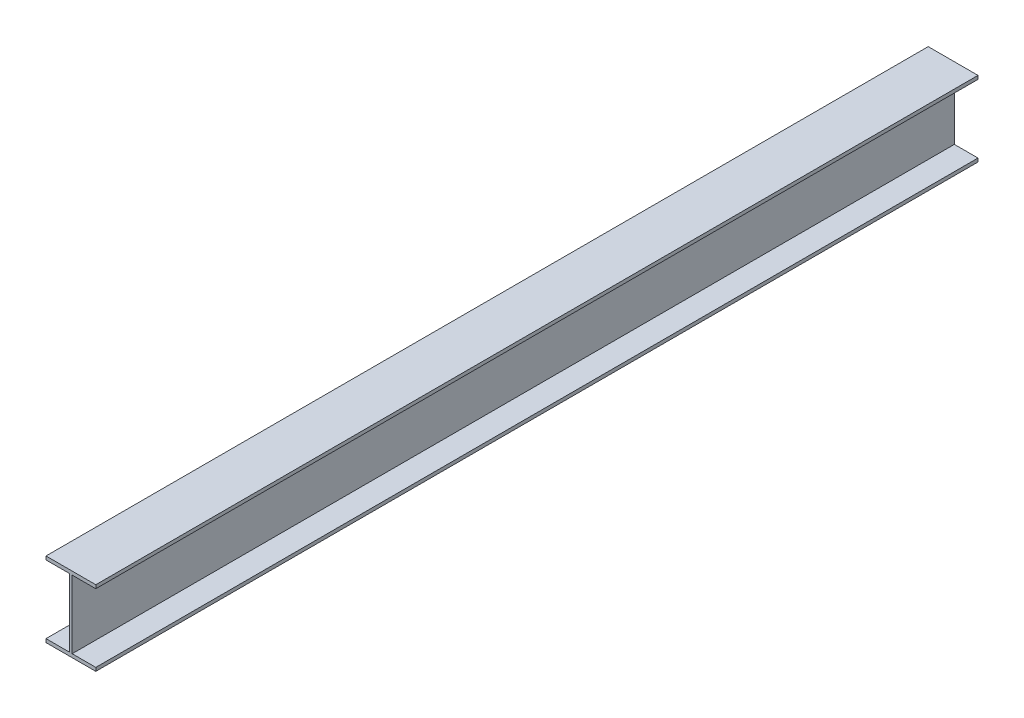
ISO-10303-21;
HEADER;
FILE_DESCRIPTION(('STEP AP214'),'2;1');
FILE_NAME('part.step','',(''),(''),'','','');
FILE_SCHEMA(('AUTOMOTIVE_DESIGN { 1 0 10303 214 1 1 1 1 }'));
ENDSEC;
DATA;
#1=APPLICATION_CONTEXT('core data for automotive mechanical design processes');
#2=APPLICATION_PROTOCOL_DEFINITION('international standard','automotive_design',2000,#1);
#3=PRODUCT_CONTEXT('',#1,'mechanical');
#4=PRODUCT('Part','Part','',(#3));
#5=PRODUCT_RELATED_PRODUCT_CATEGORY('part','',(#4));
#6=PRODUCT_DEFINITION_FORMATION('','',#4);
#7=PRODUCT_DEFINITION_CONTEXT('part definition',#1,'design');
#8=PRODUCT_DEFINITION('design','',#6,#7);
#9=PRODUCT_DEFINITION_SHAPE('','',#8);
#10=(LENGTH_UNIT() NAMED_UNIT(*) SI_UNIT(.MILLI.,.METRE.));
#11=(NAMED_UNIT(*) PLANE_ANGLE_UNIT() SI_UNIT($,.RADIAN.));
#12=(NAMED_UNIT(*) SI_UNIT($,.STERADIAN.) SOLID_ANGLE_UNIT());
#13=UNCERTAINTY_MEASURE_WITH_UNIT(LENGTH_MEASURE(1.E-05),#10,'distance_accuracy_value','');
#14=(GEOMETRIC_REPRESENTATION_CONTEXT(3) GLOBAL_UNCERTAINTY_ASSIGNED_CONTEXT((#13)) GLOBAL_UNIT_ASSIGNED_CONTEXT((#10,
#11,#12)) REPRESENTATION_CONTEXT('',''));
#15=CARTESIAN_POINT('',(0.,0.,0.));
#16=DIRECTION('',(0.,0.,1.));
#17=DIRECTION('',(1.,0.,0.));
#18=AXIS2_PLACEMENT_3D('',#15,#16,#17);
#19=CARTESIAN_POINT('',(101.6,-153.162240532958,1800.));
#20=DIRECTION('',(0.,1.,0.));
#21=DIRECTION('',(0.,0.,1.));
#22=AXIS2_PLACEMENT_3D('',#19,#20,#21);
#23=PLANE('',#22);
#24=DIRECTION('',(1.,0.,0.));
#25=VECTOR('',#24,1.);
#26=CARTESIAN_POINT('',(101.6,-153.162240532958,750.));
#27=LINE('',#26,#25);
#28=CARTESIAN_POINT('',(0.,-153.162240532958,750.));
#29=VERTEX_POINT('',#28);
#30=CARTESIAN_POINT('',(101.6,-153.162240532958,750.));
#31=VERTEX_POINT('',#30);
#32=EDGE_CURVE('E11',#29,#31,#27,.T.);
#33=ORIENTED_EDGE('',*,*,#32,.F.);
#34=DIRECTION('',(0.,0.,-1.));
#35=VECTOR('',#34,1.);
#36=CARTESIAN_POINT('',(0.,-153.162240532958,1800.));
#37=LINE('',#36,#35);
#38=CARTESIAN_POINT('',(0.,-153.162240532958,0.));
#39=VERTEX_POINT('',#38);
#40=EDGE_CURVE('E176',#29,#39,#37,.T.);
#41=ORIENTED_EDGE('',*,*,#40,.T.);
#42=DIRECTION('',(1.,0.,0.));
#43=VECTOR('',#42,1.);
#44=CARTESIAN_POINT('',(101.6,-153.162240532958,0.));
#45=LINE('',#44,#43);
#46=CARTESIAN_POINT('',(101.6,-153.162240532958,0.));
#47=VERTEX_POINT('',#46);
#48=EDGE_CURVE('E210',#39,#47,#45,.T.);
#49=ORIENTED_EDGE('',*,*,#48,.T.);
#50=DIRECTION('',(0.,0.,-1.));
#51=VECTOR('',#50,1.);
#52=CARTESIAN_POINT('',(101.6,-153.162240532958,1800.));
#53=LINE('',#52,#51);
#54=EDGE_CURVE('E181',#31,#47,#53,.T.);
#55=ORIENTED_EDGE('',*,*,#54,.F.);
#56=EDGE_LOOP('',(#33,#41,#49,#55));
#57=FACE_BOUND('',#56,.T.);
#58=ADVANCED_FACE('F38',(#57),#23,.F.);
#59=DIRECTION('',(-1.,0.,0.));
#60=VECTOR('',#59,1.);
#61=CARTESIAN_POINT('',(101.600000000001,-153.162240532958,1050.));
#62=LINE('',#61,#60);
#63=CARTESIAN_POINT('',(101.6,-153.162240532958,1050.));
#64=VERTEX_POINT('',#63);
#65=CARTESIAN_POINT('',(0.,-153.162240532958,1050.));
#66=VERTEX_POINT('',#65);
#67=EDGE_CURVE('E47',#64,#66,#62,.T.);
#68=ORIENTED_EDGE('',*,*,#67,.F.);
#69=CARTESIAN_POINT('',(101.6,-153.162240532958,1800.));
#70=VERTEX_POINT('',#69);
#71=EDGE_CURVE('E177',#70,#64,#53,.T.);
#72=ORIENTED_EDGE('',*,*,#71,.F.);
#73=DIRECTION('',(1.,0.,0.));
#74=VECTOR('',#73,1.);
#75=CARTESIAN_POINT('',(101.6,-153.162240532958,1800.));
#76=LINE('',#75,#74);
#77=CARTESIAN_POINT('',(0.,-153.162240532958,1800.));
#78=VERTEX_POINT('',#77);
#79=EDGE_CURVE('E234',#78,#70,#76,.T.);
#80=ORIENTED_EDGE('',*,*,#79,.F.);
#81=EDGE_CURVE('E172',#78,#66,#37,.T.);
#82=ORIENTED_EDGE('',*,*,#81,.T.);
#83=EDGE_LOOP('',(#68,#72,#80,#82));
#84=FACE_BOUND('',#83,.T.);
#85=ADVANCED_FACE('F259',(#84),#23,.F.);
#86=CARTESIAN_POINT('',(0.,-7.11224053295814,1800.));
#87=DIRECTION('',(1.,0.,0.));
#88=DIRECTION('',(0.,0.,-1.));
#89=AXIS2_PLACEMENT_3D('',#86,#87,#88);
#90=PLANE('',#89);
#91=DIRECTION('',(0.,-1.,0.));
#92=VECTOR('',#91,1.);
#93=CARTESIAN_POINT('',(0.,-7.11224053295814,0.));
#94=LINE('',#93,#92);
#95=CARTESIAN_POINT('',(0.,-0.000240532958142959,0.));
#96=VERTEX_POINT('',#95);
#97=CARTESIAN_POINT('',(0.,-7.11224053295814,0.));
#98=VERTEX_POINT('',#97);
#99=EDGE_CURVE('E161',#96,#98,#94,.T.);
#100=ORIENTED_EDGE('',*,*,#99,.T.);
#101=DIRECTION('',(0.,0.,-1.));
#102=VECTOR('',#101,1.);
#103=CARTESIAN_POINT('',(0.,-7.11224053295814,1800.));
#104=LINE('',#103,#102);
#105=CARTESIAN_POINT('',(0.,-7.11224053295814,1800.));
#106=VERTEX_POINT('',#105);
#107=EDGE_CURVE('E142',#106,#98,#104,.T.);
#108=ORIENTED_EDGE('',*,*,#107,.F.);
#109=DIRECTION('',(0.,-1.,0.));
#110=VECTOR('',#109,1.);
#111=CARTESIAN_POINT('',(0.,-7.11224053295814,1800.));
#112=LINE('',#111,#110);
#113=CARTESIAN_POINT('',(0.,-0.000240532958142959,1800.));
#114=VERTEX_POINT('',#113);
#115=EDGE_CURVE('E149',#114,#106,#112,.T.);
#116=ORIENTED_EDGE('',*,*,#115,.F.);
#117=DIRECTION('',(0.,0.,-1.));
#118=VECTOR('',#117,1.);
#119=CARTESIAN_POINT('',(0.,-0.000240532958142959,1800.));
#120=LINE('',#119,#118);
#121=EDGE_CURVE('E197',#114,#96,#120,.T.);
#122=ORIENTED_EDGE('',*,*,#121,.T.);
#123=EDGE_LOOP('',(#100,#108,#116,#122));
#124=FACE_BOUND('',#123,.T.);
#125=ADVANCED_FACE('F40',(#124),#90,.F.);
#126=CARTESIAN_POINT('',(47.5660357142857,-7.11224053295814,1800.));
#127=DIRECTION('',(0.,1.,0.));
#128=DIRECTION('',(-1.,0.,0.));
#129=AXIS2_PLACEMENT_3D('',#126,#127,#128);
#130=PLANE('',#129);
#131=DIRECTION('',(1.,0.,0.));
#132=VECTOR('',#131,1.);
#133=CARTESIAN_POINT('',(47.5660357142857,-7.11224053295814,0.));
#134=LINE('',#133,#132);
#135=CARTESIAN_POINT('',(47.5660357142857,-7.11224053295814,0.));
#136=VERTEX_POINT('',#135);
#137=EDGE_CURVE('E220',#98,#136,#134,.T.);
#138=ORIENTED_EDGE('',*,*,#137,.T.);
#139=DIRECTION('',(0.,0.,-1.));
#140=VECTOR('',#139,1.);
#141=CARTESIAN_POINT('',(47.5660357142857,-7.11224053295814,1800.));
#142=LINE('',#141,#140);
#143=CARTESIAN_POINT('',(47.5660357142857,-7.11224053295814,1800.));
#144=VERTEX_POINT('',#143);
#145=EDGE_CURVE('E145',#144,#136,#142,.T.);
#146=ORIENTED_EDGE('',*,*,#145,.F.);
#147=DIRECTION('',(1.,0.,0.));
#148=VECTOR('',#147,1.);
#149=CARTESIAN_POINT('',(47.5660357142857,-7.11224053295814,1800.));
#150=LINE('',#149,#148);
#151=EDGE_CURVE('E138',#106,#144,#150,.T.);
#152=ORIENTED_EDGE('',*,*,#151,.F.);
#153=ORIENTED_EDGE('',*,*,#107,.T.);
#154=EDGE_LOOP('',(#138,#146,#152,#153));
#155=FACE_BOUND('',#154,.T.);
#156=ADVANCED_FACE('F140',(#155),#130,.F.);
#157=CARTESIAN_POINT('',(47.5660357142857,-146.050240532958,1800.));
#158=DIRECTION('',(1.,0.,0.));
#159=DIRECTION('',(0.,0.,-1.));
#160=AXIS2_PLACEMENT_3D('',#157,#158,#159);
#161=PLANE('',#160);
#162=DIRECTION('',(0.,-1.,0.));
#163=VECTOR('',#162,1.);
#164=CARTESIAN_POINT('',(47.5660357142857,-146.050240532958,0.));
#165=LINE('',#164,#163);
#166=CARTESIAN_POINT('',(47.5660357142857,-146.050240532958,0.));
#167=VERTEX_POINT('',#166);
#168=EDGE_CURVE('E218',#136,#167,#165,.T.);
#169=ORIENTED_EDGE('',*,*,#168,.T.);
#170=DIRECTION('',(0.,0.,-1.));
#171=VECTOR('',#170,1.);
#172=CARTESIAN_POINT('',(47.5660357142857,-146.050240532958,1800.));
#173=LINE('',#172,#171);
#174=CARTESIAN_POINT('',(47.5660357142857,-146.050240532958,1800.));
#175=VERTEX_POINT('',#174);
#176=EDGE_CURVE('E164',#175,#167,#173,.T.);
#177=ORIENTED_EDGE('',*,*,#176,.F.);
#178=DIRECTION('',(0.,-1.,0.));
#179=VECTOR('',#178,1.);
#180=CARTESIAN_POINT('',(47.5660357142857,-146.050240532958,1800.));
#181=LINE('',#180,#179);
#182=EDGE_CURVE('E148',#144,#175,#181,.T.);
#183=ORIENTED_EDGE('',*,*,#182,.F.);
#184=ORIENTED_EDGE('',*,*,#145,.T.);
#185=EDGE_LOOP('',(#169,#177,#183,#184));
#186=FACE_BOUND('',#185,.T.);
#187=ADVANCED_FACE('F244',(#186),#161,.F.);
#188=CARTESIAN_POINT('',(0.,-146.050240532958,1800.));
#189=DIRECTION('',(0.,-1.,0.));
#190=DIRECTION('',(1.,0.,0.));
#191=AXIS2_PLACEMENT_3D('',#188,#189,#190);
#192=PLANE('',#191);
#193=DIRECTION('',(-1.,0.,0.));
#194=VECTOR('',#193,1.);
#195=CARTESIAN_POINT('',(0.,-146.050240532958,0.));
#196=LINE('',#195,#194);
#197=CARTESIAN_POINT('',(0.,-146.050240532958,0.));
#198=VERTEX_POINT('',#197);
#199=EDGE_CURVE('E216',#167,#198,#196,.T.);
#200=ORIENTED_EDGE('',*,*,#199,.T.);
#201=DIRECTION('',(0.,0.,-1.));
#202=VECTOR('',#201,1.);
#203=CARTESIAN_POINT('',(0.,-146.050240532958,1800.));
#204=LINE('',#203,#202);
#205=CARTESIAN_POINT('',(0.,-146.050240532958,1800.));
#206=VERTEX_POINT('',#205);
#207=EDGE_CURVE('E169',#206,#198,#204,.T.);
#208=ORIENTED_EDGE('',*,*,#207,.F.);
#209=DIRECTION('',(-1.,0.,0.));
#210=VECTOR('',#209,1.);
#211=CARTESIAN_POINT('',(0.,-146.050240532958,1800.));
#212=LINE('',#211,#210);
#213=EDGE_CURVE('E238',#175,#206,#212,.T.);
#214=ORIENTED_EDGE('',*,*,#213,.F.);
#215=ORIENTED_EDGE('',*,*,#176,.T.);
#216=EDGE_LOOP('',(#200,#208,#214,#215));
#217=FACE_BOUND('',#216,.T.);
#218=ADVANCED_FACE('F248',(#217),#192,.F.);
#219=CARTESIAN_POINT('',(0.,-153.162240532958,1800.));
#220=DIRECTION('',(1.,0.,0.));
#221=DIRECTION('',(0.,0.,-1.));
#222=AXIS2_PLACEMENT_3D('',#219,#220,#221);
#223=PLANE('',#222);
#224=DIRECTION('',(0.,-1.,0.));
#225=VECTOR('',#224,1.);
#226=CARTESIAN_POINT('',(0.,-153.162240532958,0.));
#227=LINE('',#226,#225);
#228=EDGE_CURVE('E213',#198,#39,#227,.T.);
#229=ORIENTED_EDGE('',*,*,#228,.T.);
#230=ORIENTED_EDGE('',*,*,#40,.F.);
#231=EDGE_CURVE('E175',#66,#29,#37,.T.);
#232=ORIENTED_EDGE('',*,*,#231,.F.);
#233=ORIENTED_EDGE('',*,*,#81,.F.);
#234=DIRECTION('',(0.,-1.,0.));
#235=VECTOR('',#234,1.);
#236=CARTESIAN_POINT('',(0.,-153.162240532958,1800.));
#237=LINE('',#236,#235);
#238=EDGE_CURVE('E236',#206,#78,#237,.T.);
#239=ORIENTED_EDGE('',*,*,#238,.F.);
#240=ORIENTED_EDGE('',*,*,#207,.T.);
#241=EDGE_LOOP('',(#229,#230,#232,#233,#239,#240));
#242=FACE_BOUND('',#241,.T.);
#243=ADVANCED_FACE('F253',(#242),#223,.F.);
#244=ORIENTED_EDGE('',*,*,#231,.T.);
#245=ORIENTED_EDGE('',*,*,#32,.T.);
#246=EDGE_CURVE('E180',#64,#31,#53,.T.);
#247=ORIENTED_EDGE('',*,*,#246,.F.);
#248=ORIENTED_EDGE('',*,*,#67,.T.);
#249=EDGE_LOOP('',(#244,#245,#247,#248));
#250=FACE_BOUND('',#249,.T.);
#251=ADVANCED_FACE('F290',(#250),#23,.F.);
#252=CARTESIAN_POINT('',(101.6,-146.050240532958,1800.));
#253=DIRECTION('',(-1.,0.,0.));
#254=DIRECTION('',(0.,0.,1.));
#255=AXIS2_PLACEMENT_3D('',#252,#253,#254);
#256=PLANE('',#255);
#257=DIRECTION('',(0.,1.,0.));
#258=VECTOR('',#257,1.);
#259=CARTESIAN_POINT('',(101.6,-146.050240532958,0.));
#260=LINE('',#259,#258);
#261=CARTESIAN_POINT('',(101.6,-146.050240532958,0.));
#262=VERTEX_POINT('',#261);
#263=EDGE_CURVE('E208',#47,#262,#260,.T.);
#264=ORIENTED_EDGE('',*,*,#263,.T.);
#265=DIRECTION('',(0.,0.,-1.));
#266=VECTOR('',#265,1.);
#267=CARTESIAN_POINT('',(101.6,-146.050240532958,1800.));
#268=LINE('',#267,#266);
#269=CARTESIAN_POINT('',(101.6,-146.050240532958,1800.));
#270=VERTEX_POINT('',#269);
#271=EDGE_CURVE('E182',#270,#262,#268,.T.);
#272=ORIENTED_EDGE('',*,*,#271,.F.);
#273=DIRECTION('',(0.,1.,0.));
#274=VECTOR('',#273,1.);
#275=CARTESIAN_POINT('',(101.6,-146.050240532958,1800.));
#276=LINE('',#275,#274);
#277=EDGE_CURVE('E232',#70,#270,#276,.T.);
#278=ORIENTED_EDGE('',*,*,#277,.F.);
#279=ORIENTED_EDGE('',*,*,#71,.T.);
#280=ORIENTED_EDGE('',*,*,#246,.T.);
#281=ORIENTED_EDGE('',*,*,#54,.T.);
#282=EDGE_LOOP('',(#264,#272,#278,#279,#280,#281));
#283=FACE_BOUND('',#282,.T.);
#284=ADVANCED_FACE('F262',(#283),#256,.F.);
#285=CARTESIAN_POINT('',(53.4080357142857,-146.050240532958,1800.));
#286=DIRECTION('',(0.,-1.,0.));
#287=DIRECTION('',(1.,0.,0.));
#288=AXIS2_PLACEMENT_3D('',#285,#286,#287);
#289=PLANE('',#288);
#290=DIRECTION('',(-1.,0.,0.));
#291=VECTOR('',#290,1.);
#292=CARTESIAN_POINT('',(53.4080357142857,-146.050240532958,0.));
#293=LINE('',#292,#291);
#294=CARTESIAN_POINT('',(53.4080357142857,-146.050240532958,0.));
#295=VERTEX_POINT('',#294);
#296=EDGE_CURVE('E206',#262,#295,#293,.T.);
#297=ORIENTED_EDGE('',*,*,#296,.T.);
#298=DIRECTION('',(0.,0.,-1.));
#299=VECTOR('',#298,1.);
#300=CARTESIAN_POINT('',(53.4080357142857,-146.050240532958,1800.));
#301=LINE('',#300,#299);
#302=CARTESIAN_POINT('',(53.4080357142857,-146.050240532958,1800.));
#303=VERTEX_POINT('',#302);
#304=EDGE_CURVE('E185',#303,#295,#301,.T.);
#305=ORIENTED_EDGE('',*,*,#304,.F.);
#306=DIRECTION('',(-1.,0.,0.));
#307=VECTOR('',#306,1.);
#308=CARTESIAN_POINT('',(53.4080357142857,-146.050240532958,1800.));
#309=LINE('',#308,#307);
#310=EDGE_CURVE('E230',#270,#303,#309,.T.);
#311=ORIENTED_EDGE('',*,*,#310,.F.);
#312=ORIENTED_EDGE('',*,*,#271,.T.);
#313=EDGE_LOOP('',(#297,#305,#311,#312));
#314=FACE_BOUND('',#313,.T.);
#315=ADVANCED_FACE('F268',(#314),#289,.F.);
#316=CARTESIAN_POINT('',(53.4080357142857,-7.11224053295815,1800.));
#317=DIRECTION('',(-1.,0.,0.));
#318=DIRECTION('',(0.,-1.,0.));
#319=AXIS2_PLACEMENT_3D('',#316,#317,#318);
#320=PLANE('',#319);
#321=DIRECTION('',(0.,1.,0.));
#322=VECTOR('',#321,1.);
#323=CARTESIAN_POINT('',(53.4080357142857,-7.11224053295815,0.));
#324=LINE('',#323,#322);
#325=CARTESIAN_POINT('',(53.4080357142857,-7.11224053295815,0.));
#326=VERTEX_POINT('',#325);
#327=EDGE_CURVE('E204',#295,#326,#324,.T.);
#328=ORIENTED_EDGE('',*,*,#327,.T.);
#329=DIRECTION('',(0.,0.,-1.));
#330=VECTOR('',#329,1.);
#331=CARTESIAN_POINT('',(53.4080357142857,-7.11224053295815,1800.));
#332=LINE('',#331,#330);
#333=CARTESIAN_POINT('',(53.4080357142857,-7.11224053295815,1800.));
#334=VERTEX_POINT('',#333);
#335=EDGE_CURVE('E188',#334,#326,#332,.T.);
#336=ORIENTED_EDGE('',*,*,#335,.F.);
#337=DIRECTION('',(0.,1.,0.));
#338=VECTOR('',#337,1.);
#339=CARTESIAN_POINT('',(53.4080357142857,-7.11224053295815,1800.));
#340=LINE('',#339,#338);
#341=EDGE_CURVE('E228',#303,#334,#340,.T.);
#342=ORIENTED_EDGE('',*,*,#341,.F.);
#343=ORIENTED_EDGE('',*,*,#304,.T.);
#344=EDGE_LOOP('',(#328,#336,#342,#343));
#345=FACE_BOUND('',#344,.T.);
#346=ADVANCED_FACE('F274',(#345),#320,.F.);
#347=CARTESIAN_POINT('',(101.6,-7.11224053295814,1800.));
#348=DIRECTION('',(0.,1.,0.));
#349=DIRECTION('',(-1.,0.,0.));
#350=AXIS2_PLACEMENT_3D('',#347,#348,#349);
#351=PLANE('',#350);
#352=DIRECTION('',(1.,0.,0.));
#353=VECTOR('',#352,1.);
#354=CARTESIAN_POINT('',(101.6,-7.11224053295814,0.));
#355=LINE('',#354,#353);
#356=CARTESIAN_POINT('',(101.6,-7.11224053295814,0.));
#357=VERTEX_POINT('',#356);
#358=EDGE_CURVE('E202',#326,#357,#355,.T.);
#359=ORIENTED_EDGE('',*,*,#358,.T.);
#360=DIRECTION('',(0.,0.,-1.));
#361=VECTOR('',#360,1.);
#362=CARTESIAN_POINT('',(101.6,-7.11224053295814,1800.));
#363=LINE('',#362,#361);
#364=CARTESIAN_POINT('',(101.6,-7.11224053295814,1800.));
#365=VERTEX_POINT('',#364);
#366=EDGE_CURVE('E191',#365,#357,#363,.T.);
#367=ORIENTED_EDGE('',*,*,#366,.F.);
#368=DIRECTION('',(1.,0.,0.));
#369=VECTOR('',#368,1.);
#370=CARTESIAN_POINT('',(101.6,-7.11224053295814,1800.));
#371=LINE('',#370,#369);
#372=EDGE_CURVE('E226',#334,#365,#371,.T.);
#373=ORIENTED_EDGE('',*,*,#372,.F.);
#374=ORIENTED_EDGE('',*,*,#335,.T.);
#375=EDGE_LOOP('',(#359,#367,#373,#374));
#376=FACE_BOUND('',#375,.T.);
#377=ADVANCED_FACE('F278',(#376),#351,.F.);
#378=CARTESIAN_POINT('',(101.6,-0.000240532958130516,1800.));
#379=DIRECTION('',(-1.,0.,0.));
#380=DIRECTION('',(0.,0.,1.));
#381=AXIS2_PLACEMENT_3D('',#378,#379,#380);
#382=PLANE('',#381);
#383=DIRECTION('',(0.,1.,0.));
#384=VECTOR('',#383,1.);
#385=CARTESIAN_POINT('',(101.6,-0.000240532958130516,0.));
#386=LINE('',#385,#384);
#387=CARTESIAN_POINT('',(101.6,-0.000240532958130516,0.));
#388=VERTEX_POINT('',#387);
#389=EDGE_CURVE('E200',#357,#388,#386,.T.);
#390=ORIENTED_EDGE('',*,*,#389,.T.);
#391=DIRECTION('',(0.,0.,-1.));
#392=VECTOR('',#391,1.);
#393=CARTESIAN_POINT('',(101.6,-0.000240532958130516,1800.));
#394=LINE('',#393,#392);
#395=CARTESIAN_POINT('',(101.6,-0.000240532958130516,1800.));
#396=VERTEX_POINT('',#395);
#397=EDGE_CURVE('E194',#396,#388,#394,.T.);
#398=ORIENTED_EDGE('',*,*,#397,.F.);
#399=DIRECTION('',(0.,1.,0.));
#400=VECTOR('',#399,1.);
#401=CARTESIAN_POINT('',(101.6,-0.000240532958130516,1800.));
#402=LINE('',#401,#400);
#403=EDGE_CURVE('E224',#365,#396,#402,.T.);
#404=ORIENTED_EDGE('',*,*,#403,.F.);
#405=ORIENTED_EDGE('',*,*,#366,.T.);
#406=EDGE_LOOP('',(#390,#398,#404,#405));
#407=FACE_BOUND('',#406,.T.);
#408=ADVANCED_FACE('F283',(#407),#382,.F.);
#409=CARTESIAN_POINT('',(0.,-0.000240532958142959,1800.));
#410=DIRECTION('',(0.,-1.,0.));
#411=DIRECTION('',(1.,0.,0.));
#412=AXIS2_PLACEMENT_3D('',#409,#410,#411);
#413=PLANE('',#412);
#414=DIRECTION('',(-1.,0.,0.));
#415=VECTOR('',#414,1.);
#416=CARTESIAN_POINT('',(0.,-0.000240532958142959,0.));
#417=LINE('',#416,#415);
#418=EDGE_CURVE('E158',#388,#96,#417,.T.);
#419=ORIENTED_EDGE('',*,*,#418,.T.);
#420=ORIENTED_EDGE('',*,*,#121,.F.);
#421=DIRECTION('',(-1.,0.,0.));
#422=VECTOR('',#421,1.);
#423=CARTESIAN_POINT('',(0.,-0.000240532958142959,1800.));
#424=LINE('',#423,#422);
#425=EDGE_CURVE('E154',#396,#114,#424,.T.);
#426=ORIENTED_EDGE('',*,*,#425,.F.);
#427=ORIENTED_EDGE('',*,*,#397,.T.);
#428=EDGE_LOOP('',(#419,#420,#426,#427));
#429=FACE_BOUND('',#428,.T.);
#430=ADVANCED_FACE('F286',(#429),#413,.F.);
#431=CARTESIAN_POINT('',(0.,0.,1800.));
#432=DIRECTION('',(0.,0.,-1.));
#433=DIRECTION('',(-1.,0.,0.));
#434=AXIS2_PLACEMENT_3D('',#431,#432,#433);
#435=PLANE('',#434);
#436=ORIENTED_EDGE('',*,*,#115,.T.);
#437=ORIENTED_EDGE('',*,*,#151,.T.);
#438=ORIENTED_EDGE('',*,*,#182,.T.);
#439=ORIENTED_EDGE('',*,*,#213,.T.);
#440=ORIENTED_EDGE('',*,*,#238,.T.);
#441=ORIENTED_EDGE('',*,*,#79,.T.);
#442=ORIENTED_EDGE('',*,*,#277,.T.);
#443=ORIENTED_EDGE('',*,*,#310,.T.);
#444=ORIENTED_EDGE('',*,*,#341,.T.);
#445=ORIENTED_EDGE('',*,*,#372,.T.);
#446=ORIENTED_EDGE('',*,*,#403,.T.);
#447=ORIENTED_EDGE('',*,*,#425,.T.);
#448=EDGE_LOOP('',(#436,#437,#438,#439,#440,#441,#442,#443,#444,#445,#446,#447));
#449=FACE_BOUND('',#448,.T.);
#450=ADVANCED_FACE('F152',(#449),#435,.F.);
#451=CARTESIAN_POINT('',(0.,0.,0.));
#452=DIRECTION('',(0.,0.,-1.));
#453=DIRECTION('',(-1.,0.,0.));
#454=AXIS2_PLACEMENT_3D('',#451,#452,#453);
#455=PLANE('',#454);
#456=ORIENTED_EDGE('',*,*,#99,.F.);
#457=ORIENTED_EDGE('',*,*,#418,.F.);
#458=ORIENTED_EDGE('',*,*,#389,.F.);
#459=ORIENTED_EDGE('',*,*,#358,.F.);
#460=ORIENTED_EDGE('',*,*,#327,.F.);
#461=ORIENTED_EDGE('',*,*,#296,.F.);
#462=ORIENTED_EDGE('',*,*,#263,.F.);
#463=ORIENTED_EDGE('',*,*,#48,.F.);
#464=ORIENTED_EDGE('',*,*,#228,.F.);
#465=ORIENTED_EDGE('',*,*,#199,.F.);
#466=ORIENTED_EDGE('',*,*,#168,.F.);
#467=ORIENTED_EDGE('',*,*,#137,.F.);
#468=EDGE_LOOP('',(#456,#457,#458,#459,#460,#461,#462,#463,#464,#465,#466,#467));
#469=FACE_BOUND('',#468,.T.);
#470=ADVANCED_FACE('F288',(#469),#455,.T.);
#471=CLOSED_SHELL('',(#58,#85,#125,#156,#187,#218,#243,#251,#284,#315,#346,#377,#408,#430,#450,#470));
#472=MANIFOLD_SOLID_BREP('B2',#471);
#473=ADVANCED_BREP_SHAPE_REPRESENTATION('',(#18,#472),#14);
#474=SHAPE_DEFINITION_REPRESENTATION(#9,#473);
ENDSEC;
END-ISO-10303-21;
